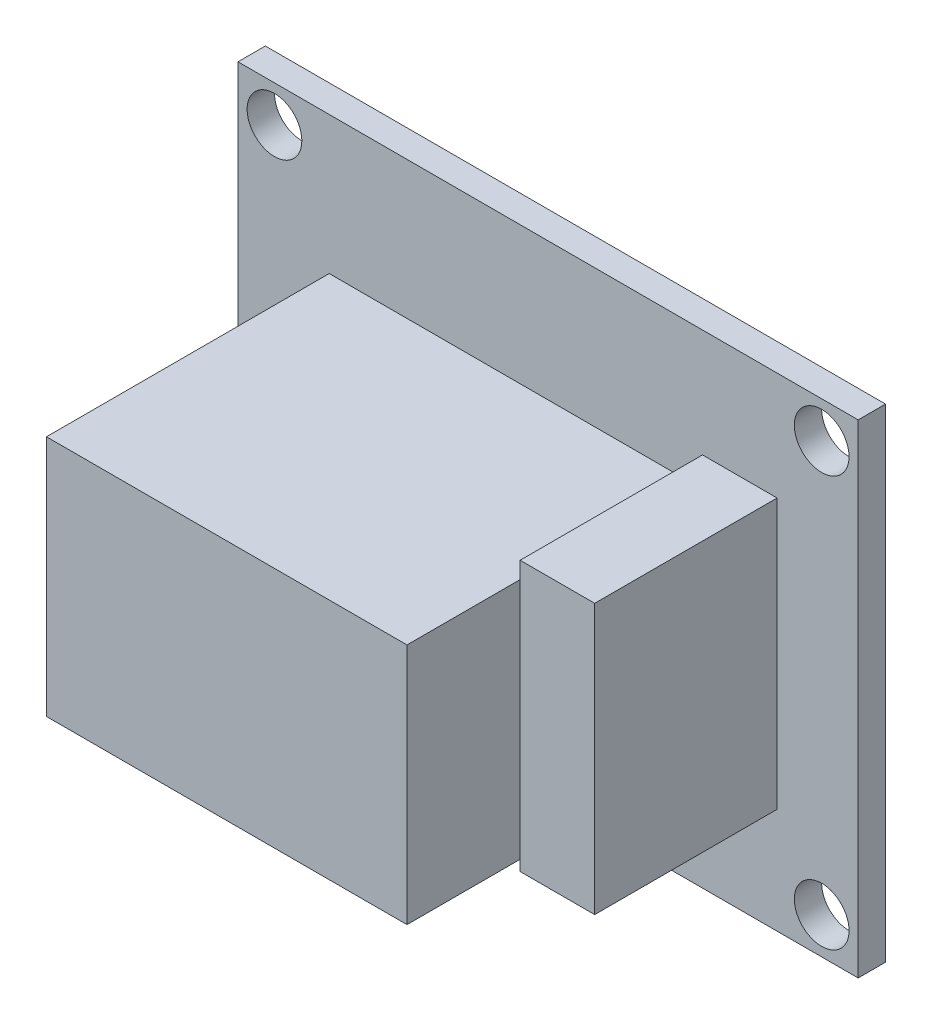
ISO-10303-21;
HEADER;
FILE_DESCRIPTION(('STEP AP214'),'2;1');
FILE_NAME('part.step','',(''),(''),'','','');
FILE_SCHEMA(('AUTOMOTIVE_DESIGN { 1 0 10303 214 1 1 1 1 }'));
ENDSEC;
DATA;
#1=APPLICATION_CONTEXT('core data for automotive mechanical design processes');
#2=APPLICATION_PROTOCOL_DEFINITION('international standard','automotive_design',2000,#1);
#3=PRODUCT_CONTEXT('',#1,'mechanical');
#4=PRODUCT('Part','Part','',(#3));
#5=PRODUCT_RELATED_PRODUCT_CATEGORY('part','',(#4));
#6=PRODUCT_DEFINITION_FORMATION('','',#4);
#7=PRODUCT_DEFINITION_CONTEXT('part definition',#1,'design');
#8=PRODUCT_DEFINITION('design','',#6,#7);
#9=PRODUCT_DEFINITION_SHAPE('','',#8);
#10=(LENGTH_UNIT() NAMED_UNIT(*) SI_UNIT(.MILLI.,.METRE.));
#11=(NAMED_UNIT(*) PLANE_ANGLE_UNIT() SI_UNIT($,.RADIAN.));
#12=(NAMED_UNIT(*) SI_UNIT($,.STERADIAN.) SOLID_ANGLE_UNIT());
#13=UNCERTAINTY_MEASURE_WITH_UNIT(LENGTH_MEASURE(1.E-05),#10,'distance_accuracy_value','');
#14=(GEOMETRIC_REPRESENTATION_CONTEXT(3) GLOBAL_UNCERTAINTY_ASSIGNED_CONTEXT((#13)) GLOBAL_UNIT_ASSIGNED_CONTEXT((#10,
#11,#12)) REPRESENTATION_CONTEXT('',''));
#15=CARTESIAN_POINT('',(0.,0.,0.));
#16=DIRECTION('',(0.,0.,1.));
#17=DIRECTION('',(1.,0.,0.));
#18=AXIS2_PLACEMENT_3D('',#15,#16,#17);
#19=CARTESIAN_POINT('',(0.,0.,1.5));
#20=DIRECTION('',(0.,0.,-1.));
#21=DIRECTION('',(-1.,0.,0.));
#22=AXIS2_PLACEMENT_3D('',#19,#20,#21);
#23=PLANE('',#22);
#24=DIRECTION('',(0.,-1.,0.));
#25=VECTOR('',#24,1.);
#26=CARTESIAN_POINT('',(5.00079408355686,18.9472036155693,1.5));
#27=LINE('',#26,#25);
#28=CARTESIAN_POINT('',(5.00079408355686,18.9472036155693,1.5));
#29=VERTEX_POINT('',#28);
#30=CARTESIAN_POINT('',(5.00079408355686,5.6658244862804,1.5));
#31=VERTEX_POINT('',#30);
#32=EDGE_CURVE('E145',#29,#31,#27,.T.);
#33=ORIENTED_EDGE('',*,*,#32,.F.);
#34=DIRECTION('',(-1.,0.,0.));
#35=VECTOR('',#34,1.);
#36=CARTESIAN_POINT('',(5.00079408355686,18.9472036155693,1.5));
#37=LINE('',#36,#35);
#38=CARTESIAN_POINT('',(24.765615119311,18.9472036155693,1.5));
#39=VERTEX_POINT('',#38);
#40=EDGE_CURVE('E158',#39,#29,#37,.T.);
#41=ORIENTED_EDGE('',*,*,#40,.F.);
#42=DIRECTION('',(0.,1.,0.));
#43=VECTOR('',#42,1.);
#44=CARTESIAN_POINT('',(24.765615119311,18.9472036155693,1.5));
#45=LINE('',#44,#43);
#46=CARTESIAN_POINT('',(24.765615119311,5.6658244862804,1.5));
#47=VERTEX_POINT('',#46);
#48=EDGE_CURVE('E167',#47,#39,#45,.T.);
#49=ORIENTED_EDGE('',*,*,#48,.F.);
#50=DIRECTION('',(1.,0.,0.));
#51=VECTOR('',#50,1.);
#52=CARTESIAN_POINT('',(5.00079408355686,5.6658244862804,1.5));
#53=LINE('',#52,#51);
#54=EDGE_CURVE('E148',#31,#47,#53,.T.);
#55=ORIENTED_EDGE('',*,*,#54,.F.);
#56=EDGE_LOOP('',(#33,#41,#49,#55));
#57=FACE_BOUND('',#56,.T.);
#58=CARTESIAN_POINT('',(2.,2.,1.5));
#59=DIRECTION('',(0.,0.,1.));
#60=DIRECTION('',(1.,0.,0.));
#61=AXIS2_PLACEMENT_3D('',#58,#59,#60);
#62=CIRCLE('',#61,1.5);
#63=CARTESIAN_POINT('',(3.5,2.,1.5));
#64=VERTEX_POINT('',#63);
#65=EDGE_CURVE('E190',#64,#64,#62,.T.);
#66=ORIENTED_EDGE('',*,*,#65,.F.);
#67=EDGE_LOOP('',(#66));
#68=FACE_BOUND('',#67,.T.);
#69=CARTESIAN_POINT('',(2.,24.5,1.5));
#70=DIRECTION('',(0.,0.,1.));
#71=DIRECTION('',(1.,0.,0.));
#72=AXIS2_PLACEMENT_3D('',#69,#70,#71);
#73=CIRCLE('',#72,1.5);
#74=CARTESIAN_POINT('',(3.5,24.5,1.5));
#75=VERTEX_POINT('',#74);
#76=EDGE_CURVE('E202',#75,#75,#73,.T.);
#77=ORIENTED_EDGE('',*,*,#76,.F.);
#78=EDGE_LOOP('',(#77));
#79=FACE_BOUND('',#78,.T.);
#80=DIRECTION('',(0.,-1.,0.));
#81=VECTOR('',#80,1.);
#82=CARTESIAN_POINT('',(0.,0.,1.5));
#83=LINE('',#82,#81);
#84=CARTESIAN_POINT('',(0.,26.5,1.5));
#85=VERTEX_POINT('',#84);
#86=CARTESIAN_POINT('',(0.,0.,1.5));
#87=VERTEX_POINT('',#86);
#88=EDGE_CURVE('E208',#85,#87,#83,.T.);
#89=ORIENTED_EDGE('',*,*,#88,.T.);
#90=DIRECTION('',(1.,0.,0.));
#91=VECTOR('',#90,1.);
#92=CARTESIAN_POINT('',(0.,0.,1.5));
#93=LINE('',#92,#91);
#94=CARTESIAN_POINT('',(34.,0.,1.5));
#95=VERTEX_POINT('',#94);
#96=EDGE_CURVE('E211',#87,#95,#93,.T.);
#97=ORIENTED_EDGE('',*,*,#96,.T.);
#98=DIRECTION('',(0.,1.,0.));
#99=VECTOR('',#98,1.);
#100=CARTESIAN_POINT('',(34.,0.,1.5));
#101=LINE('',#100,#99);
#102=CARTESIAN_POINT('',(34.,26.5,1.5));
#103=VERTEX_POINT('',#102);
#104=EDGE_CURVE('E214',#95,#103,#101,.T.);
#105=ORIENTED_EDGE('',*,*,#104,.T.);
#106=DIRECTION('',(-1.,0.,0.));
#107=VECTOR('',#106,1.);
#108=CARTESIAN_POINT('',(0.,26.5,1.5));
#109=LINE('',#108,#107);
#110=EDGE_CURVE('E216',#103,#85,#109,.T.);
#111=ORIENTED_EDGE('',*,*,#110,.T.);
#112=EDGE_LOOP('',(#89,#97,#105,#111));
#113=FACE_BOUND('',#112,.T.);
#114=CARTESIAN_POINT('',(32.,24.5,1.5));
#115=DIRECTION('',(0.,0.,1.));
#116=DIRECTION('',(1.,0.,0.));
#117=AXIS2_PLACEMENT_3D('',#114,#115,#116);
#118=CIRCLE('',#117,1.5);
#119=CARTESIAN_POINT('',(33.5,24.5,1.5));
#120=VERTEX_POINT('',#119);
#121=EDGE_CURVE('E196',#120,#120,#118,.T.);
#122=ORIENTED_EDGE('',*,*,#121,.F.);
#123=EDGE_LOOP('',(#122));
#124=FACE_BOUND('',#123,.T.);
#125=CARTESIAN_POINT('',(32.,2.,1.5));
#126=DIRECTION('',(0.,0.,1.));
#127=DIRECTION('',(1.,0.,0.));
#128=AXIS2_PLACEMENT_3D('',#125,#126,#127);
#129=CIRCLE('',#128,1.5);
#130=CARTESIAN_POINT('',(33.5,2.,1.5));
#131=VERTEX_POINT('',#130);
#132=EDGE_CURVE('E184',#131,#131,#129,.T.);
#133=ORIENTED_EDGE('',*,*,#132,.F.);
#134=EDGE_LOOP('',(#133));
#135=FACE_BOUND('',#134,.T.);
#136=DIRECTION('',(0.,-1.,0.));
#137=VECTOR('',#136,1.);
#138=CARTESIAN_POINT('',(25.4671815942643,20.5680640921856,1.5));
#139=LINE('',#138,#137);
#140=CARTESIAN_POINT('',(25.4671815942643,20.5680640921856,1.5));
#141=VERTEX_POINT('',#140);
#142=CARTESIAN_POINT('',(25.4671815942643,5.78678422334132,1.5));
#143=VERTEX_POINT('',#142);
#144=EDGE_CURVE('E144',#141,#143,#139,.T.);
#145=ORIENTED_EDGE('',*,*,#144,.F.);
#146=DIRECTION('',(-1.,0.,0.));
#147=VECTOR('',#146,1.);
#148=CARTESIAN_POINT('',(25.4671815942643,20.5680640921856,1.5));
#149=LINE('',#148,#147);
#150=CARTESIAN_POINT('',(29.5556207069234,20.5680640921856,1.5));
#151=VERTEX_POINT('',#150);
#152=EDGE_CURVE('E141',#151,#141,#149,.T.);
#153=ORIENTED_EDGE('',*,*,#152,.F.);
#154=DIRECTION('',(0.,1.,0.));
#155=VECTOR('',#154,1.);
#156=CARTESIAN_POINT('',(29.5556207069234,20.5680640921856,1.5));
#157=LINE('',#156,#155);
#158=CARTESIAN_POINT('',(29.5556207069234,5.78678422334132,1.5));
#159=VERTEX_POINT('',#158);
#160=EDGE_CURVE('E55',#159,#151,#157,.T.);
#161=ORIENTED_EDGE('',*,*,#160,.F.);
#162=DIRECTION('',(1.,0.,0.));
#163=VECTOR('',#162,1.);
#164=CARTESIAN_POINT('',(25.4671815942643,5.78678422334132,1.5));
#165=LINE('',#164,#163);
#166=EDGE_CURVE('E50',#143,#159,#165,.T.);
#167=ORIENTED_EDGE('',*,*,#166,.F.);
#168=EDGE_LOOP('',(#145,#153,#161,#167));
#169=FACE_BOUND('',#168,.T.);
#170=ADVANCED_FACE('F35',(#57,#68,#79,#113,#124,#135,#169),#23,.F.);
#171=CARTESIAN_POINT('',(0.,0.,0.));
#172=DIRECTION('',(0.,0.,-1.));
#173=DIRECTION('',(-1.,0.,0.));
#174=AXIS2_PLACEMENT_3D('',#171,#172,#173);
#175=PLANE('',#174);
#176=CARTESIAN_POINT('',(2.,2.,0.));
#177=DIRECTION('',(0.,0.,1.));
#178=DIRECTION('',(1.,0.,0.));
#179=AXIS2_PLACEMENT_3D('',#176,#177,#178);
#180=CIRCLE('',#179,1.5);
#181=CARTESIAN_POINT('',(3.5,2.,0.));
#182=VERTEX_POINT('',#181);
#183=EDGE_CURVE('E187',#182,#182,#180,.T.);
#184=ORIENTED_EDGE('',*,*,#183,.T.);
#185=EDGE_LOOP('',(#184));
#186=FACE_BOUND('',#185,.T.);
#187=CARTESIAN_POINT('',(2.,24.5,0.));
#188=DIRECTION('',(0.,0.,1.));
#189=DIRECTION('',(1.,0.,0.));
#190=AXIS2_PLACEMENT_3D('',#187,#188,#189);
#191=CIRCLE('',#190,1.5);
#192=CARTESIAN_POINT('',(3.5,24.5,0.));
#193=VERTEX_POINT('',#192);
#194=EDGE_CURVE('E199',#193,#193,#191,.T.);
#195=ORIENTED_EDGE('',*,*,#194,.T.);
#196=EDGE_LOOP('',(#195));
#197=FACE_BOUND('',#196,.T.);
#198=DIRECTION('',(0.,-1.,0.));
#199=VECTOR('',#198,1.);
#200=CARTESIAN_POINT('',(0.,0.,0.));
#201=LINE('',#200,#199);
#202=CARTESIAN_POINT('',(0.,26.5,0.));
#203=VERTEX_POINT('',#202);
#204=CARTESIAN_POINT('',(0.,0.,0.));
#205=VERTEX_POINT('',#204);
#206=EDGE_CURVE('E205',#203,#205,#201,.T.);
#207=ORIENTED_EDGE('',*,*,#206,.F.);
#208=DIRECTION('',(-1.,0.,0.));
#209=VECTOR('',#208,1.);
#210=CARTESIAN_POINT('',(0.,26.5,0.));
#211=LINE('',#210,#209);
#212=CARTESIAN_POINT('',(34.,26.5,0.));
#213=VERTEX_POINT('',#212);
#214=EDGE_CURVE('E212',#213,#203,#211,.T.);
#215=ORIENTED_EDGE('',*,*,#214,.F.);
#216=DIRECTION('',(0.,1.,0.));
#217=VECTOR('',#216,1.);
#218=CARTESIAN_POINT('',(34.,0.,0.));
#219=LINE('',#218,#217);
#220=CARTESIAN_POINT('',(34.,0.,0.));
#221=VERTEX_POINT('',#220);
#222=EDGE_CURVE('E223',#221,#213,#219,.T.);
#223=ORIENTED_EDGE('',*,*,#222,.F.);
#224=DIRECTION('',(1.,0.,0.));
#225=VECTOR('',#224,1.);
#226=CARTESIAN_POINT('',(0.,0.,0.));
#227=LINE('',#226,#225);
#228=EDGE_CURVE('E221',#205,#221,#227,.T.);
#229=ORIENTED_EDGE('',*,*,#228,.F.);
#230=EDGE_LOOP('',(#207,#215,#223,#229));
#231=FACE_BOUND('',#230,.T.);
#232=CARTESIAN_POINT('',(32.,24.5,0.));
#233=DIRECTION('',(0.,0.,1.));
#234=DIRECTION('',(1.,0.,0.));
#235=AXIS2_PLACEMENT_3D('',#232,#233,#234);
#236=CIRCLE('',#235,1.5);
#237=CARTESIAN_POINT('',(33.5,24.5,0.));
#238=VERTEX_POINT('',#237);
#239=EDGE_CURVE('E193',#238,#238,#236,.T.);
#240=ORIENTED_EDGE('',*,*,#239,.T.);
#241=EDGE_LOOP('',(#240));
#242=FACE_BOUND('',#241,.T.);
#243=CARTESIAN_POINT('',(32.,2.,0.));
#244=DIRECTION('',(0.,0.,1.));
#245=DIRECTION('',(1.,0.,0.));
#246=AXIS2_PLACEMENT_3D('',#243,#244,#245);
#247=CIRCLE('',#246,1.5);
#248=CARTESIAN_POINT('',(33.5,2.,0.));
#249=VERTEX_POINT('',#248);
#250=EDGE_CURVE('E183',#249,#249,#247,.T.);
#251=ORIENTED_EDGE('',*,*,#250,.T.);
#252=EDGE_LOOP('',(#251));
#253=FACE_BOUND('',#252,.T.);
#254=ADVANCED_FACE('F241',(#186,#197,#231,#242,#253),#175,.T.);
#255=CARTESIAN_POINT('',(0.,0.,1.5));
#256=DIRECTION('',(1.,0.,0.));
#257=DIRECTION('',(0.,0.,-1.));
#258=AXIS2_PLACEMENT_3D('',#255,#256,#257);
#259=PLANE('',#258);
#260=ORIENTED_EDGE('',*,*,#206,.T.);
#261=DIRECTION('',(0.,0.,-1.));
#262=VECTOR('',#261,1.);
#263=CARTESIAN_POINT('',(0.,0.,1.5));
#264=LINE('',#263,#262);
#265=EDGE_CURVE('E11',#87,#205,#264,.T.);
#266=ORIENTED_EDGE('',*,*,#265,.F.);
#267=ORIENTED_EDGE('',*,*,#88,.F.);
#268=DIRECTION('',(0.,0.,-1.));
#269=VECTOR('',#268,1.);
#270=CARTESIAN_POINT('',(0.,26.5,1.5));
#271=LINE('',#270,#269);
#272=EDGE_CURVE('E218',#85,#203,#271,.T.);
#273=ORIENTED_EDGE('',*,*,#272,.T.);
#274=EDGE_LOOP('',(#260,#266,#267,#273));
#275=FACE_BOUND('',#274,.T.);
#276=ADVANCED_FACE('F37',(#275),#259,.F.);
#277=CARTESIAN_POINT('',(0.,0.,1.5));
#278=DIRECTION('',(0.,1.,0.));
#279=DIRECTION('',(0.,0.,1.));
#280=AXIS2_PLACEMENT_3D('',#277,#278,#279);
#281=PLANE('',#280);
#282=ORIENTED_EDGE('',*,*,#228,.T.);
#283=DIRECTION('',(0.,0.,-1.));
#284=VECTOR('',#283,1.);
#285=CARTESIAN_POINT('',(34.,0.,1.5));
#286=LINE('',#285,#284);
#287=EDGE_CURVE('E43',#95,#221,#286,.T.);
#288=ORIENTED_EDGE('',*,*,#287,.F.);
#289=ORIENTED_EDGE('',*,*,#96,.F.);
#290=ORIENTED_EDGE('',*,*,#265,.T.);
#291=EDGE_LOOP('',(#282,#288,#289,#290));
#292=FACE_BOUND('',#291,.T.);
#293=ADVANCED_FACE('F252',(#292),#281,.F.);
#294=CARTESIAN_POINT('',(34.,0.,1.5));
#295=DIRECTION('',(-1.,0.,0.));
#296=DIRECTION('',(0.,0.,1.));
#297=AXIS2_PLACEMENT_3D('',#294,#295,#296);
#298=PLANE('',#297);
#299=ORIENTED_EDGE('',*,*,#222,.T.);
#300=DIRECTION('',(0.,0.,-1.));
#301=VECTOR('',#300,1.);
#302=CARTESIAN_POINT('',(34.,26.5,1.5));
#303=LINE('',#302,#301);
#304=EDGE_CURVE('E228',#103,#213,#303,.T.);
#305=ORIENTED_EDGE('',*,*,#304,.F.);
#306=ORIENTED_EDGE('',*,*,#104,.F.);
#307=ORIENTED_EDGE('',*,*,#287,.T.);
#308=EDGE_LOOP('',(#299,#305,#306,#307));
#309=FACE_BOUND('',#308,.T.);
#310=ADVANCED_FACE('F235',(#309),#298,.F.);
#311=CARTESIAN_POINT('',(0.,26.5,1.5));
#312=DIRECTION('',(0.,-1.,0.));
#313=DIRECTION('',(0.,0.,-1.));
#314=AXIS2_PLACEMENT_3D('',#311,#312,#313);
#315=PLANE('',#314);
#316=ORIENTED_EDGE('',*,*,#214,.T.);
#317=ORIENTED_EDGE('',*,*,#272,.F.);
#318=ORIENTED_EDGE('',*,*,#110,.F.);
#319=ORIENTED_EDGE('',*,*,#304,.T.);
#320=EDGE_LOOP('',(#316,#317,#318,#319));
#321=FACE_BOUND('',#320,.T.);
#322=ADVANCED_FACE('F245',(#321),#315,.F.);
#323=CARTESIAN_POINT('',(2.,24.5,1.5));
#324=DIRECTION('',(0.,0.,-1.));
#325=DIRECTION('',(-1.,0.,0.));
#326=AXIS2_PLACEMENT_3D('',#323,#324,#325);
#327=CYLINDRICAL_SURFACE('',#326,1.5);
#328=ORIENTED_EDGE('',*,*,#76,.T.);
#329=EDGE_LOOP('',(#328));
#330=FACE_BOUND('',#329,.T.);
#331=ORIENTED_EDGE('',*,*,#194,.F.);
#332=EDGE_LOOP('',(#331));
#333=FACE_BOUND('',#332,.T.);
#334=ADVANCED_FACE('F269',(#330,#333),#327,.F.);
#335=CARTESIAN_POINT('',(32.,24.5,1.5));
#336=DIRECTION('',(0.,0.,-1.));
#337=DIRECTION('',(-1.,0.,0.));
#338=AXIS2_PLACEMENT_3D('',#335,#336,#337);
#339=CYLINDRICAL_SURFACE('',#338,1.5);
#340=ORIENTED_EDGE('',*,*,#121,.T.);
#341=EDGE_LOOP('',(#340));
#342=FACE_BOUND('',#341,.T.);
#343=ORIENTED_EDGE('',*,*,#239,.F.);
#344=EDGE_LOOP('',(#343));
#345=FACE_BOUND('',#344,.T.);
#346=ADVANCED_FACE('F276',(#342,#345),#339,.F.);
#347=CARTESIAN_POINT('',(2.,2.,1.5));
#348=DIRECTION('',(0.,0.,-1.));
#349=DIRECTION('',(-1.,0.,0.));
#350=AXIS2_PLACEMENT_3D('',#347,#348,#349);
#351=CYLINDRICAL_SURFACE('',#350,1.5);
#352=ORIENTED_EDGE('',*,*,#65,.T.);
#353=EDGE_LOOP('',(#352));
#354=FACE_BOUND('',#353,.T.);
#355=ORIENTED_EDGE('',*,*,#183,.F.);
#356=EDGE_LOOP('',(#355));
#357=FACE_BOUND('',#356,.T.);
#358=ADVANCED_FACE('F281',(#354,#357),#351,.F.);
#359=CARTESIAN_POINT('',(32.,2.,1.5));
#360=DIRECTION('',(0.,0.,-1.));
#361=DIRECTION('',(-1.,0.,0.));
#362=AXIS2_PLACEMENT_3D('',#359,#360,#361);
#363=CYLINDRICAL_SURFACE('',#362,1.5);
#364=ORIENTED_EDGE('',*,*,#132,.T.);
#365=EDGE_LOOP('',(#364));
#366=FACE_BOUND('',#365,.T.);
#367=ORIENTED_EDGE('',*,*,#250,.F.);
#368=EDGE_LOOP('',(#367));
#369=FACE_BOUND('',#368,.T.);
#370=ADVANCED_FACE('F291',(#366,#369),#363,.F.);
#371=CARTESIAN_POINT('',(5.00079408355686,18.9472036155693,17.));
#372=DIRECTION('',(1.,0.,0.));
#373=DIRECTION('',(0.,0.,-1.));
#374=AXIS2_PLACEMENT_3D('',#371,#372,#373);
#375=PLANE('',#374);
#376=ORIENTED_EDGE('',*,*,#32,.T.);
#377=DIRECTION('',(0.,0.,-1.));
#378=VECTOR('',#377,1.);
#379=CARTESIAN_POINT('',(5.00079408355686,5.6658244862804,17.));
#380=LINE('',#379,#378);
#381=CARTESIAN_POINT('',(5.00079408355686,5.6658244862804,17.));
#382=VERTEX_POINT('',#381);
#383=EDGE_CURVE('E180',#382,#31,#380,.T.);
#384=ORIENTED_EDGE('',*,*,#383,.F.);
#385=DIRECTION('',(0.,-1.,0.));
#386=VECTOR('',#385,1.);
#387=CARTESIAN_POINT('',(5.00079408355686,18.9472036155693,17.));
#388=LINE('',#387,#386);
#389=CARTESIAN_POINT('',(5.00079408355686,18.9472036155693,17.));
#390=VERTEX_POINT('',#389);
#391=EDGE_CURVE('E154',#390,#382,#388,.T.);
#392=ORIENTED_EDGE('',*,*,#391,.F.);
#393=DIRECTION('',(0.,0.,-1.));
#394=VECTOR('',#393,1.);
#395=CARTESIAN_POINT('',(5.00079408355686,18.9472036155693,17.));
#396=LINE('',#395,#394);
#397=EDGE_CURVE('E163',#390,#29,#396,.T.);
#398=ORIENTED_EDGE('',*,*,#397,.T.);
#399=EDGE_LOOP('',(#376,#384,#392,#398));
#400=FACE_BOUND('',#399,.T.);
#401=ADVANCED_FACE('F298',(#400),#375,.F.);
#402=CARTESIAN_POINT('',(5.00079408355686,5.6658244862804,17.));
#403=DIRECTION('',(0.,1.,0.));
#404=DIRECTION('',(0.,0.,1.));
#405=AXIS2_PLACEMENT_3D('',#402,#403,#404);
#406=PLANE('',#405);
#407=ORIENTED_EDGE('',*,*,#54,.T.);
#408=DIRECTION('',(0.,0.,-1.));
#409=VECTOR('',#408,1.);
#410=CARTESIAN_POINT('',(24.765615119311,5.6658244862804,17.));
#411=LINE('',#410,#409);
#412=CARTESIAN_POINT('',(24.765615119311,5.6658244862804,17.));
#413=VERTEX_POINT('',#412);
#414=EDGE_CURVE('E177',#413,#47,#411,.T.);
#415=ORIENTED_EDGE('',*,*,#414,.F.);
#416=DIRECTION('',(1.,0.,0.));
#417=VECTOR('',#416,1.);
#418=CARTESIAN_POINT('',(5.00079408355686,5.6658244862804,17.));
#419=LINE('',#418,#417);
#420=EDGE_CURVE('E157',#382,#413,#419,.T.);
#421=ORIENTED_EDGE('',*,*,#420,.F.);
#422=ORIENTED_EDGE('',*,*,#383,.T.);
#423=EDGE_LOOP('',(#407,#415,#421,#422));
#424=FACE_BOUND('',#423,.T.);
#425=ADVANCED_FACE('F302',(#424),#406,.F.);
#426=CARTESIAN_POINT('',(24.765615119311,18.9472036155693,17.));
#427=DIRECTION('',(-1.,0.,0.));
#428=DIRECTION('',(0.,0.,1.));
#429=AXIS2_PLACEMENT_3D('',#426,#427,#428);
#430=PLANE('',#429);
#431=ORIENTED_EDGE('',*,*,#48,.T.);
#432=DIRECTION('',(0.,0.,-1.));
#433=VECTOR('',#432,1.);
#434=CARTESIAN_POINT('',(24.765615119311,18.9472036155693,17.));
#435=LINE('',#434,#433);
#436=CARTESIAN_POINT('',(24.765615119311,18.9472036155693,17.));
#437=VERTEX_POINT('',#436);
#438=EDGE_CURVE('E174',#437,#39,#435,.T.);
#439=ORIENTED_EDGE('',*,*,#438,.F.);
#440=DIRECTION('',(0.,1.,0.));
#441=VECTOR('',#440,1.);
#442=CARTESIAN_POINT('',(24.765615119311,18.9472036155693,17.));
#443=LINE('',#442,#441);
#444=EDGE_CURVE('E160',#413,#437,#443,.T.);
#445=ORIENTED_EDGE('',*,*,#444,.F.);
#446=ORIENTED_EDGE('',*,*,#414,.T.);
#447=EDGE_LOOP('',(#431,#439,#445,#446));
#448=FACE_BOUND('',#447,.T.);
#449=ADVANCED_FACE('F306',(#448),#430,.F.);
#450=CARTESIAN_POINT('',(5.00079408355686,18.9472036155693,17.));
#451=DIRECTION('',(0.,-1.,0.));
#452=DIRECTION('',(0.,0.,-1.));
#453=AXIS2_PLACEMENT_3D('',#450,#451,#452);
#454=PLANE('',#453);
#455=ORIENTED_EDGE('',*,*,#40,.T.);
#456=ORIENTED_EDGE('',*,*,#397,.F.);
#457=DIRECTION('',(-1.,0.,0.));
#458=VECTOR('',#457,1.);
#459=CARTESIAN_POINT('',(5.00079408355686,18.9472036155693,17.));
#460=LINE('',#459,#458);
#461=EDGE_CURVE('E162',#437,#390,#460,.T.);
#462=ORIENTED_EDGE('',*,*,#461,.F.);
#463=ORIENTED_EDGE('',*,*,#438,.T.);
#464=EDGE_LOOP('',(#455,#456,#462,#463));
#465=FACE_BOUND('',#464,.T.);
#466=ADVANCED_FACE('F310',(#465),#454,.F.);
#467=CARTESIAN_POINT('',(0.,0.,17.));
#468=DIRECTION('',(0.,0.,1.));
#469=DIRECTION('',(1.,0.,0.));
#470=AXIS2_PLACEMENT_3D('',#467,#468,#469);
#471=PLANE('',#470);
#472=ORIENTED_EDGE('',*,*,#391,.T.);
#473=ORIENTED_EDGE('',*,*,#420,.T.);
#474=ORIENTED_EDGE('',*,*,#444,.T.);
#475=ORIENTED_EDGE('',*,*,#461,.T.);
#476=EDGE_LOOP('',(#472,#473,#474,#475));
#477=FACE_BOUND('',#476,.T.);
#478=ADVANCED_FACE('F314',(#477),#471,.T.);
#479=CARTESIAN_POINT('',(25.4671815942643,20.5680640921856,11.5));
#480=DIRECTION('',(1.,0.,0.));
#481=DIRECTION('',(0.,0.,-1.));
#482=AXIS2_PLACEMENT_3D('',#479,#480,#481);
#483=PLANE('',#482);
#484=ORIENTED_EDGE('',*,*,#144,.T.);
#485=DIRECTION('',(0.,0.,-1.));
#486=VECTOR('',#485,1.);
#487=CARTESIAN_POINT('',(25.4671815942643,5.78678422334132,11.5));
#488=LINE('',#487,#486);
#489=CARTESIAN_POINT('',(25.4671815942643,5.78678422334132,11.5));
#490=VERTEX_POINT('',#489);
#491=EDGE_CURVE('E125',#490,#143,#488,.T.);
#492=ORIENTED_EDGE('',*,*,#491,.F.);
#493=DIRECTION('',(0.,-1.,0.));
#494=VECTOR('',#493,1.);
#495=CARTESIAN_POINT('',(25.4671815942643,20.5680640921856,11.5));
#496=LINE('',#495,#494);
#497=CARTESIAN_POINT('',(25.4671815942643,20.5680640921856,11.5));
#498=VERTEX_POINT('',#497);
#499=EDGE_CURVE('E132',#498,#490,#496,.T.);
#500=ORIENTED_EDGE('',*,*,#499,.F.);
#501=DIRECTION('',(0.,0.,-1.));
#502=VECTOR('',#501,1.);
#503=CARTESIAN_POINT('',(25.4671815942643,20.5680640921856,11.5));
#504=LINE('',#503,#502);
#505=EDGE_CURVE('E476',#498,#141,#504,.T.);
#506=ORIENTED_EDGE('',*,*,#505,.T.);
#507=EDGE_LOOP('',(#484,#492,#500,#506));
#508=FACE_BOUND('',#507,.T.);
#509=ADVANCED_FACE('F143',(#508),#483,.F.);
#510=CARTESIAN_POINT('',(25.4671815942643,5.78678422334132,11.5));
#511=DIRECTION('',(0.,1.,0.));
#512=DIRECTION('',(0.,0.,1.));
#513=AXIS2_PLACEMENT_3D('',#510,#511,#512);
#514=PLANE('',#513);
#515=ORIENTED_EDGE('',*,*,#166,.T.);
#516=DIRECTION('',(0.,0.,-1.));
#517=VECTOR('',#516,1.);
#518=CARTESIAN_POINT('',(29.5556207069234,5.78678422334132,11.5));
#519=LINE('',#518,#517);
#520=CARTESIAN_POINT('',(29.5556207069234,5.78678422334132,11.5));
#521=VERTEX_POINT('',#520);
#522=EDGE_CURVE('E128',#521,#159,#519,.T.);
#523=ORIENTED_EDGE('',*,*,#522,.F.);
#524=DIRECTION('',(1.,0.,0.));
#525=VECTOR('',#524,1.);
#526=CARTESIAN_POINT('',(25.4671815942643,5.78678422334132,11.5));
#527=LINE('',#526,#525);
#528=EDGE_CURVE('E121',#490,#521,#527,.T.);
#529=ORIENTED_EDGE('',*,*,#528,.F.);
#530=ORIENTED_EDGE('',*,*,#491,.T.);
#531=EDGE_LOOP('',(#515,#523,#529,#530));
#532=FACE_BOUND('',#531,.T.);
#533=ADVANCED_FACE('F123',(#532),#514,.F.);
#534=CARTESIAN_POINT('',(29.5556207069234,20.5680640921856,11.5));
#535=DIRECTION('',(-1.,0.,0.));
#536=DIRECTION('',(0.,0.,1.));
#537=AXIS2_PLACEMENT_3D('',#534,#535,#536);
#538=PLANE('',#537);
#539=ORIENTED_EDGE('',*,*,#160,.T.);
#540=DIRECTION('',(0.,0.,-1.));
#541=VECTOR('',#540,1.);
#542=CARTESIAN_POINT('',(29.5556207069234,20.5680640921856,11.5));
#543=LINE('',#542,#541);
#544=CARTESIAN_POINT('',(29.5556207069234,20.5680640921856,11.5));
#545=VERTEX_POINT('',#544);
#546=EDGE_CURVE('E150',#545,#151,#543,.T.);
#547=ORIENTED_EDGE('',*,*,#546,.F.);
#548=DIRECTION('',(0.,1.,0.));
#549=VECTOR('',#548,1.);
#550=CARTESIAN_POINT('',(29.5556207069234,20.5680640921856,11.5));
#551=LINE('',#550,#549);
#552=EDGE_CURVE('E131',#521,#545,#551,.T.);
#553=ORIENTED_EDGE('',*,*,#552,.F.);
#554=ORIENTED_EDGE('',*,*,#522,.T.);
#555=EDGE_LOOP('',(#539,#547,#553,#554));
#556=FACE_BOUND('',#555,.T.);
#557=ADVANCED_FACE('F323',(#556),#538,.F.);
#558=CARTESIAN_POINT('',(25.4671815942643,20.5680640921856,11.5));
#559=DIRECTION('',(0.,-1.,0.));
#560=DIRECTION('',(0.,0.,-1.));
#561=AXIS2_PLACEMENT_3D('',#558,#559,#560);
#562=PLANE('',#561);
#563=ORIENTED_EDGE('',*,*,#152,.T.);
#564=ORIENTED_EDGE('',*,*,#505,.F.);
#565=DIRECTION('',(-1.,0.,0.));
#566=VECTOR('',#565,1.);
#567=CARTESIAN_POINT('',(25.4671815942643,20.5680640921856,11.5));
#568=LINE('',#567,#566);
#569=EDGE_CURVE('E137',#545,#498,#568,.T.);
#570=ORIENTED_EDGE('',*,*,#569,.F.);
#571=ORIENTED_EDGE('',*,*,#546,.T.);
#572=EDGE_LOOP('',(#563,#564,#570,#571));
#573=FACE_BOUND('',#572,.T.);
#574=ADVANCED_FACE('F326',(#573),#562,.F.);
#575=CARTESIAN_POINT('',(0.,0.,11.5));
#576=DIRECTION('',(0.,0.,1.));
#577=DIRECTION('',(1.,0.,0.));
#578=AXIS2_PLACEMENT_3D('',#575,#576,#577);
#579=PLANE('',#578);
#580=ORIENTED_EDGE('',*,*,#499,.T.);
#581=ORIENTED_EDGE('',*,*,#528,.T.);
#582=ORIENTED_EDGE('',*,*,#552,.T.);
#583=ORIENTED_EDGE('',*,*,#569,.T.);
#584=EDGE_LOOP('',(#580,#581,#582,#583));
#585=FACE_BOUND('',#584,.T.);
#586=ADVANCED_FACE('F135',(#585),#579,.T.);
#587=CLOSED_SHELL('',(#170,#254,#276,#293,#310,#322,#334,#346,#358,#370,#401,#425,#449,#466,
#478,#509,#533,#557,#574,#586));
#588=MANIFOLD_SOLID_BREP('B2',#587);
#589=ADVANCED_BREP_SHAPE_REPRESENTATION('',(#18,#588),#14);
#590=SHAPE_DEFINITION_REPRESENTATION(#9,#589);
ENDSEC;
END-ISO-10303-21;
